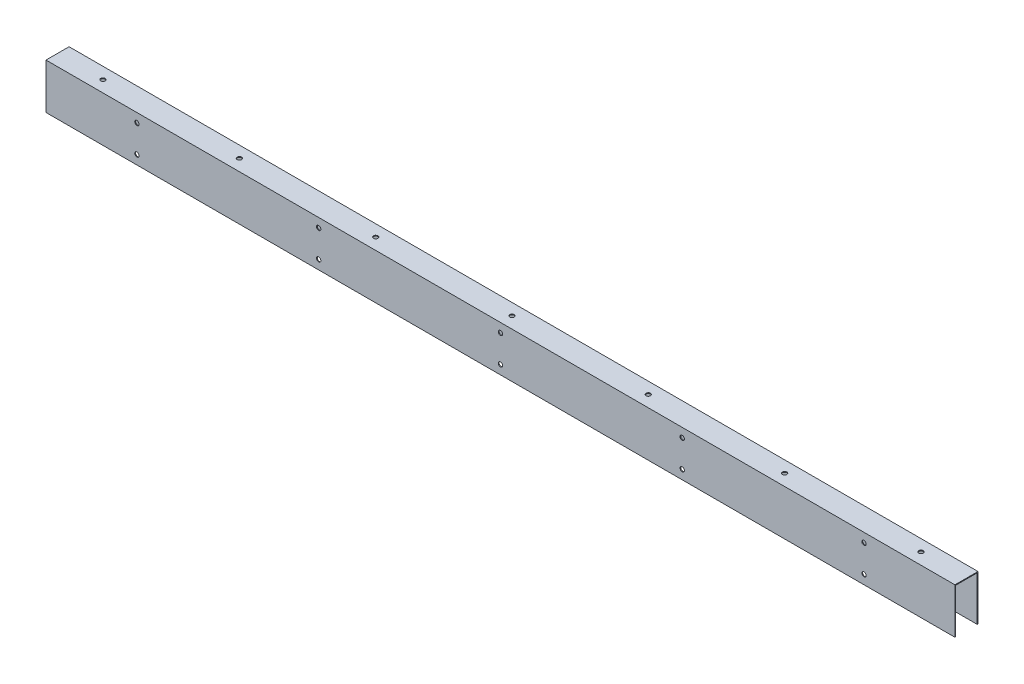
ISO-10303-21;
HEADER;
FILE_DESCRIPTION(('STEP AP214'),'2;1');
FILE_NAME('part.step','',(''),(''),'','','');
FILE_SCHEMA(('AUTOMOTIVE_DESIGN { 1 0 10303 214 1 1 1 1 }'));
ENDSEC;
DATA;
#1=APPLICATION_CONTEXT('core data for automotive mechanical design processes');
#2=APPLICATION_PROTOCOL_DEFINITION('international standard','automotive_design',2000,#1);
#3=PRODUCT_CONTEXT('',#1,'mechanical');
#4=PRODUCT('Part','Part','',(#3));
#5=PRODUCT_RELATED_PRODUCT_CATEGORY('part','',(#4));
#6=PRODUCT_DEFINITION_FORMATION('','',#4);
#7=PRODUCT_DEFINITION_CONTEXT('part definition',#1,'design');
#8=PRODUCT_DEFINITION('design','',#6,#7);
#9=PRODUCT_DEFINITION_SHAPE('','',#8);
#10=(LENGTH_UNIT() NAMED_UNIT(*) SI_UNIT(.MILLI.,.METRE.));
#11=(NAMED_UNIT(*) PLANE_ANGLE_UNIT() SI_UNIT($,.RADIAN.));
#12=(NAMED_UNIT(*) SI_UNIT($,.STERADIAN.) SOLID_ANGLE_UNIT());
#13=UNCERTAINTY_MEASURE_WITH_UNIT(LENGTH_MEASURE(1.E-05),#10,'distance_accuracy_value','');
#14=(GEOMETRIC_REPRESENTATION_CONTEXT(3) GLOBAL_UNCERTAINTY_ASSIGNED_CONTEXT((#13)) GLOBAL_UNIT_ASSIGNED_CONTEXT((#10,
#11,#12)) REPRESENTATION_CONTEXT('',''));
#15=CARTESIAN_POINT('',(0.,0.,0.));
#16=DIRECTION('',(0.,0.,1.));
#17=DIRECTION('',(1.,0.,0.));
#18=AXIS2_PLACEMENT_3D('',#15,#16,#17);
#19=CARTESIAN_POINT('',(499.999999999999,-25.,-12.7));
#20=DIRECTION('',(1.,0.,0.));
#21=DIRECTION('',(0.,0.,-1.));
#22=AXIS2_PLACEMENT_3D('',#19,#20,#21);
#23=PLANE('',#22);
#24=DIRECTION('',(0.,0.,-1.));
#25=VECTOR('',#24,1.);
#26=CARTESIAN_POINT('',(499.999999999999,-25.,-12.7));
#27=LINE('',#26,#25);
#28=CARTESIAN_POINT('',(499.999999999999,-25.,12.7));
#29=VERTEX_POINT('',#28);
#30=CARTESIAN_POINT('',(499.999999999999,-25.,11.84));
#31=VERTEX_POINT('',#30);
#32=EDGE_CURVE('E134',#29,#31,#27,.T.);
#33=ORIENTED_EDGE('',*,*,#32,.T.);
#34=DIRECTION('',(0.,1.,0.));
#35=VECTOR('',#34,1.);
#36=CARTESIAN_POINT('',(499.999999999999,-25.,11.84));
#37=LINE('',#36,#35);
#38=CARTESIAN_POINT('',(499.999999999999,24.14,11.84));
#39=VERTEX_POINT('',#38);
#40=EDGE_CURVE('E116',#31,#39,#37,.T.);
#41=ORIENTED_EDGE('',*,*,#40,.T.);
#42=DIRECTION('',(0.,0.,-1.));
#43=VECTOR('',#42,1.);
#44=CARTESIAN_POINT('',(499.999999999999,24.14,-12.7));
#45=LINE('',#44,#43);
#46=CARTESIAN_POINT('',(499.999999999999,24.14,-11.84));
#47=VERTEX_POINT('',#46);
#48=EDGE_CURVE('E111',#39,#47,#45,.T.);
#49=ORIENTED_EDGE('',*,*,#48,.T.);
#50=DIRECTION('',(0.,-1.,0.));
#51=VECTOR('',#50,1.);
#52=CARTESIAN_POINT('',(499.999999999999,-25.,-11.84));
#53=LINE('',#52,#51);
#54=CARTESIAN_POINT('',(499.999999999999,-25.,-11.84));
#55=VERTEX_POINT('',#54);
#56=EDGE_CURVE('E99',#47,#55,#53,.T.);
#57=ORIENTED_EDGE('',*,*,#56,.T.);
#58=CARTESIAN_POINT('',(499.999999999999,-25.,-12.7));
#59=VERTEX_POINT('',#58);
#60=EDGE_CURVE('E133',#55,#59,#27,.T.);
#61=ORIENTED_EDGE('',*,*,#60,.T.);
#62=DIRECTION('',(0.,1.,0.));
#63=VECTOR('',#62,1.);
#64=CARTESIAN_POINT('',(499.999999999999,-25.,-12.7));
#65=LINE('',#64,#63);
#66=CARTESIAN_POINT('',(499.999999999999,25.,-12.7));
#67=VERTEX_POINT('',#66);
#68=EDGE_CURVE('E146',#59,#67,#65,.T.);
#69=ORIENTED_EDGE('',*,*,#68,.T.);
#70=DIRECTION('',(0.,0.,-1.));
#71=VECTOR('',#70,1.);
#72=CARTESIAN_POINT('',(499.999999999999,25.,-12.7));
#73=LINE('',#72,#71);
#74=CARTESIAN_POINT('',(499.999999999999,25.,12.7));
#75=VERTEX_POINT('',#74);
#76=EDGE_CURVE('E117',#75,#67,#73,.T.);
#77=ORIENTED_EDGE('',*,*,#76,.F.);
#78=DIRECTION('',(0.,1.,0.));
#79=VECTOR('',#78,1.);
#80=CARTESIAN_POINT('',(499.999999999999,-25.,12.7));
#81=LINE('',#80,#79);
#82=EDGE_CURVE('E57',#29,#75,#81,.T.);
#83=ORIENTED_EDGE('',*,*,#82,.F.);
#84=EDGE_LOOP('',(#33,#41,#49,#57,#61,#69,#77,#83));
#85=FACE_BOUND('',#84,.T.);
#86=ADVANCED_FACE('F33',(#85),#23,.T.);
#87=CARTESIAN_POINT('',(-500.000000000001,-25.,-12.7));
#88=DIRECTION('',(-1.,0.,0.));
#89=DIRECTION('',(0.,0.,1.));
#90=AXIS2_PLACEMENT_3D('',#87,#88,#89);
#91=PLANE('',#90);
#92=DIRECTION('',(0.,0.,1.));
#93=VECTOR('',#92,1.);
#94=CARTESIAN_POINT('',(-500.000000000001,24.14,-12.7));
#95=LINE('',#94,#93);
#96=CARTESIAN_POINT('',(-500.000000000001,24.14,-11.84));
#97=VERTEX_POINT('',#96);
#98=CARTESIAN_POINT('',(-500.000000000001,24.14,11.84));
#99=VERTEX_POINT('',#98);
#100=EDGE_CURVE('E11',#97,#99,#95,.T.);
#101=ORIENTED_EDGE('',*,*,#100,.T.);
#102=DIRECTION('',(0.,-1.,0.));
#103=VECTOR('',#102,1.);
#104=CARTESIAN_POINT('',(-500.000000000001,-25.,11.84));
#105=LINE('',#104,#103);
#106=CARTESIAN_POINT('',(-500.000000000001,-25.,11.84));
#107=VERTEX_POINT('',#106);
#108=EDGE_CURVE('E106',#99,#107,#105,.T.);
#109=ORIENTED_EDGE('',*,*,#108,.T.);
#110=DIRECTION('',(0.,0.,1.));
#111=VECTOR('',#110,1.);
#112=CARTESIAN_POINT('',(-500.000000000001,-25.,-12.7));
#113=LINE('',#112,#111);
#114=CARTESIAN_POINT('',(-500.000000000001,-25.,12.7));
#115=VERTEX_POINT('',#114);
#116=EDGE_CURVE('E139',#107,#115,#113,.T.);
#117=ORIENTED_EDGE('',*,*,#116,.T.);
#118=DIRECTION('',(0.,1.,0.));
#119=VECTOR('',#118,1.);
#120=CARTESIAN_POINT('',(-500.000000000001,-25.,12.7));
#121=LINE('',#120,#119);
#122=CARTESIAN_POINT('',(-500.000000000001,25.,12.7));
#123=VERTEX_POINT('',#122);
#124=EDGE_CURVE('E148',#115,#123,#121,.T.);
#125=ORIENTED_EDGE('',*,*,#124,.T.);
#126=DIRECTION('',(0.,0.,1.));
#127=VECTOR('',#126,1.);
#128=CARTESIAN_POINT('',(-500.000000000001,25.,-12.7));
#129=LINE('',#128,#127);
#130=CARTESIAN_POINT('',(-500.000000000001,25.,-12.7));
#131=VERTEX_POINT('',#130);
#132=EDGE_CURVE('E127',#131,#123,#129,.T.);
#133=ORIENTED_EDGE('',*,*,#132,.F.);
#134=DIRECTION('',(0.,1.,0.));
#135=VECTOR('',#134,1.);
#136=CARTESIAN_POINT('',(-500.000000000001,-25.,-12.7));
#137=LINE('',#136,#135);
#138=CARTESIAN_POINT('',(-500.000000000001,-25.,-12.7));
#139=VERTEX_POINT('',#138);
#140=EDGE_CURVE('E150',#139,#131,#137,.T.);
#141=ORIENTED_EDGE('',*,*,#140,.F.);
#142=CARTESIAN_POINT('',(-500.000000000001,-25.,-11.84));
#143=VERTEX_POINT('',#142);
#144=EDGE_CURVE('E140',#139,#143,#113,.T.);
#145=ORIENTED_EDGE('',*,*,#144,.T.);
#146=DIRECTION('',(0.,1.,0.));
#147=VECTOR('',#146,1.);
#148=CARTESIAN_POINT('',(-500.000000000001,-25.,-11.84));
#149=LINE('',#148,#147);
#150=EDGE_CURVE('E49',#143,#97,#149,.T.);
#151=ORIENTED_EDGE('',*,*,#150,.T.);
#152=EDGE_LOOP('',(#101,#109,#117,#125,#133,#141,#145,#151));
#153=FACE_BOUND('',#152,.T.);
#154=ADVANCED_FACE('F271',(#153),#91,.T.);
#155=CARTESIAN_POINT('',(0.,-25.,0.));
#156=DIRECTION('',(0.,1.,0.));
#157=DIRECTION('',(0.,0.,1.));
#158=AXIS2_PLACEMENT_3D('',#155,#156,#157);
#159=PLANE('',#158);
#160=DIRECTION('',(-1.,0.,0.));
#161=VECTOR('',#160,1.);
#162=CARTESIAN_POINT('',(0.,-25.,11.84));
#163=LINE('',#162,#161);
#164=EDGE_CURVE('E41',#31,#107,#163,.T.);
#165=ORIENTED_EDGE('',*,*,#164,.F.);
#166=ORIENTED_EDGE('',*,*,#32,.F.);
#167=DIRECTION('',(1.,0.,0.));
#168=VECTOR('',#167,1.);
#169=CARTESIAN_POINT('',(-500.000000000001,-25.,12.7));
#170=LINE('',#169,#168);
#171=EDGE_CURVE('E143',#115,#29,#170,.T.);
#172=ORIENTED_EDGE('',*,*,#171,.F.);
#173=ORIENTED_EDGE('',*,*,#116,.F.);
#174=EDGE_LOOP('',(#165,#166,#172,#173));
#175=FACE_BOUND('',#174,.T.);
#176=ADVANCED_FACE('F277',(#175),#159,.F.);
#177=DIRECTION('',(1.,0.,0.));
#178=VECTOR('',#177,1.);
#179=CARTESIAN_POINT('',(0.,-25.,-11.84));
#180=LINE('',#179,#178);
#181=EDGE_CURVE('E103',#143,#55,#180,.T.);
#182=ORIENTED_EDGE('',*,*,#181,.F.);
#183=ORIENTED_EDGE('',*,*,#144,.F.);
#184=DIRECTION('',(-1.,0.,0.));
#185=VECTOR('',#184,1.);
#186=CARTESIAN_POINT('',(-500.000000000001,-25.,-12.7));
#187=LINE('',#186,#185);
#188=EDGE_CURVE('E136',#59,#139,#187,.T.);
#189=ORIENTED_EDGE('',*,*,#188,.F.);
#190=ORIENTED_EDGE('',*,*,#60,.F.);
#191=EDGE_LOOP('',(#182,#183,#189,#190));
#192=FACE_BOUND('',#191,.T.);
#193=ADVANCED_FACE('F291',(#192),#159,.F.);
#194=CARTESIAN_POINT('',(-500.000000000001,-25.,12.7));
#195=DIRECTION('',(0.,0.,1.));
#196=DIRECTION('',(1.,0.,0.));
#197=AXIS2_PLACEMENT_3D('',#194,#195,#196);
#198=PLANE('',#197);
#199=CARTESIAN_POINT('',(-200.,-15.0000000000014,12.7));
#200=DIRECTION('',(0.,0.,1.));
#201=DIRECTION('',(1.,0.,0.));
#202=AXIS2_PLACEMENT_3D('',#199,#200,#201);
#203=CIRCLE('',#202,2.4);
#204=CARTESIAN_POINT('',(-197.6,-15.0000000000014,12.7));
#205=VERTEX_POINT('',#204);
#206=EDGE_CURVE('E159',#205,#205,#203,.F.);
#207=ORIENTED_EDGE('',*,*,#206,.T.);
#208=EDGE_LOOP('',(#207));
#209=FACE_BOUND('',#208,.T.);
#210=CARTESIAN_POINT('',(0.,15.,12.7));
#211=DIRECTION('',(0.,0.,1.));
#212=DIRECTION('',(1.,0.,0.));
#213=AXIS2_PLACEMENT_3D('',#210,#211,#212);
#214=CIRCLE('',#213,2.4);
#215=CARTESIAN_POINT('',(2.4,15.,12.7));
#216=VERTEX_POINT('',#215);
#217=EDGE_CURVE('E242',#216,#216,#214,.F.);
#218=ORIENTED_EDGE('',*,*,#217,.T.);
#219=EDGE_LOOP('',(#218));
#220=FACE_BOUND('',#219,.T.);
#221=CARTESIAN_POINT('',(0.,-15.,12.7));
#222=DIRECTION('',(0.,0.,1.));
#223=DIRECTION('',(1.,0.,0.));
#224=AXIS2_PLACEMENT_3D('',#221,#222,#223);
#225=CIRCLE('',#224,2.4);
#226=CARTESIAN_POINT('',(2.4,-15.,12.7));
#227=VERTEX_POINT('',#226);
#228=EDGE_CURVE('E225',#227,#227,#225,.F.);
#229=ORIENTED_EDGE('',*,*,#228,.T.);
#230=EDGE_LOOP('',(#229));
#231=FACE_BOUND('',#230,.T.);
#232=CARTESIAN_POINT('',(200.,15.,12.7));
#233=DIRECTION('',(0.,0.,1.));
#234=DIRECTION('',(1.,0.,0.));
#235=AXIS2_PLACEMENT_3D('',#232,#233,#234);
#236=CIRCLE('',#235,2.4);
#237=CARTESIAN_POINT('',(202.4,15.,12.7));
#238=VERTEX_POINT('',#237);
#239=EDGE_CURVE('E221',#238,#238,#236,.F.);
#240=ORIENTED_EDGE('',*,*,#239,.T.);
#241=EDGE_LOOP('',(#240));
#242=FACE_BOUND('',#241,.T.);
#243=CARTESIAN_POINT('',(-400.,14.9999999999972,12.7));
#244=DIRECTION('',(0.,0.,1.));
#245=DIRECTION('',(1.,0.,0.));
#246=AXIS2_PLACEMENT_3D('',#243,#244,#245);
#247=CIRCLE('',#246,2.40000000000003);
#248=CARTESIAN_POINT('',(-397.6,14.9999999999972,12.7));
#249=VERTEX_POINT('',#248);
#250=EDGE_CURVE('E217',#249,#249,#247,.F.);
#251=ORIENTED_EDGE('',*,*,#250,.T.);
#252=EDGE_LOOP('',(#251));
#253=FACE_BOUND('',#252,.T.);
#254=CARTESIAN_POINT('',(-400.,-15.0000000000028,12.7));
#255=DIRECTION('',(0.,0.,1.));
#256=DIRECTION('',(1.,0.,0.));
#257=AXIS2_PLACEMENT_3D('',#254,#255,#256);
#258=CIRCLE('',#257,2.40000000000003);
#259=CARTESIAN_POINT('',(-397.6,-15.0000000000028,12.7));
#260=VERTEX_POINT('',#259);
#261=EDGE_CURVE('E212',#260,#260,#258,.F.);
#262=ORIENTED_EDGE('',*,*,#261,.T.);
#263=EDGE_LOOP('',(#262));
#264=FACE_BOUND('',#263,.T.);
#265=CARTESIAN_POINT('',(-200.,14.9999999999986,12.7));
#266=DIRECTION('',(0.,0.,1.));
#267=DIRECTION('',(1.,0.,0.));
#268=AXIS2_PLACEMENT_3D('',#265,#266,#267);
#269=CIRCLE('',#268,2.4);
#270=CARTESIAN_POINT('',(-197.6,14.9999999999986,12.7));
#271=VERTEX_POINT('',#270);
#272=EDGE_CURVE('E207',#271,#271,#269,.F.);
#273=ORIENTED_EDGE('',*,*,#272,.T.);
#274=EDGE_LOOP('',(#273));
#275=FACE_BOUND('',#274,.T.);
#276=CARTESIAN_POINT('',(200.,-15.,12.7));
#277=DIRECTION('',(0.,0.,1.));
#278=DIRECTION('',(1.,0.,0.));
#279=AXIS2_PLACEMENT_3D('',#276,#277,#278);
#280=CIRCLE('',#279,2.4);
#281=CARTESIAN_POINT('',(202.4,-15.,12.7));
#282=VERTEX_POINT('',#281);
#283=EDGE_CURVE('E202',#282,#282,#280,.F.);
#284=ORIENTED_EDGE('',*,*,#283,.T.);
#285=EDGE_LOOP('',(#284));
#286=FACE_BOUND('',#285,.T.);
#287=CARTESIAN_POINT('',(400.,15.,12.7));
#288=DIRECTION('',(0.,0.,1.));
#289=DIRECTION('',(1.,0.,0.));
#290=AXIS2_PLACEMENT_3D('',#287,#288,#289);
#291=CIRCLE('',#290,2.40000000000003);
#292=CARTESIAN_POINT('',(402.4,15.,12.7));
#293=VERTEX_POINT('',#292);
#294=EDGE_CURVE('E197',#293,#293,#291,.F.);
#295=ORIENTED_EDGE('',*,*,#294,.T.);
#296=EDGE_LOOP('',(#295));
#297=FACE_BOUND('',#296,.T.);
#298=CARTESIAN_POINT('',(400.,-15.,12.7));
#299=DIRECTION('',(0.,0.,1.));
#300=DIRECTION('',(1.,0.,0.));
#301=AXIS2_PLACEMENT_3D('',#298,#299,#300);
#302=CIRCLE('',#301,2.40000000000003);
#303=CARTESIAN_POINT('',(402.4,-15.,12.7));
#304=VERTEX_POINT('',#303);
#305=EDGE_CURVE('E192',#304,#304,#302,.F.);
#306=ORIENTED_EDGE('',*,*,#305,.T.);
#307=EDGE_LOOP('',(#306));
#308=FACE_BOUND('',#307,.T.);
#309=ORIENTED_EDGE('',*,*,#82,.T.);
#310=DIRECTION('',(1.,0.,0.));
#311=VECTOR('',#310,1.);
#312=CARTESIAN_POINT('',(-500.000000000001,25.,12.7));
#313=LINE('',#312,#311);
#314=EDGE_CURVE('E130',#123,#75,#313,.T.);
#315=ORIENTED_EDGE('',*,*,#314,.F.);
#316=ORIENTED_EDGE('',*,*,#124,.F.);
#317=ORIENTED_EDGE('',*,*,#171,.T.);
#318=EDGE_LOOP('',(#309,#315,#316,#317));
#319=FACE_BOUND('',#318,.T.);
#320=ADVANCED_FACE('F279',(#209,#220,#231,#242,#253,#264,#275,#286,#297,#308,#319),#198,.T.);
#321=CARTESIAN_POINT('',(-500.000000000001,-25.,-12.7));
#322=DIRECTION('',(0.,0.,-1.));
#323=DIRECTION('',(-1.,0.,0.));
#324=AXIS2_PLACEMENT_3D('',#321,#322,#323);
#325=PLANE('',#324);
#326=CARTESIAN_POINT('',(-200.,-15.0000000000014,-12.7));
#327=DIRECTION('',(0.,0.,-1.));
#328=DIRECTION('',(-1.,0.,0.));
#329=AXIS2_PLACEMENT_3D('',#326,#327,#328);
#330=CIRCLE('',#329,2.4);
#331=CARTESIAN_POINT('',(-202.4,-15.0000000000014,-12.7));
#332=VERTEX_POINT('',#331);
#333=EDGE_CURVE('E248',#332,#332,#330,.F.);
#334=ORIENTED_EDGE('',*,*,#333,.T.);
#335=EDGE_LOOP('',(#334));
#336=FACE_BOUND('',#335,.T.);
#337=CARTESIAN_POINT('',(0.,15.,-12.7));
#338=DIRECTION('',(0.,0.,-1.));
#339=DIRECTION('',(-1.,0.,0.));
#340=AXIS2_PLACEMENT_3D('',#337,#338,#339);
#341=CIRCLE('',#340,2.4);
#342=CARTESIAN_POINT('',(-2.4,15.,-12.7));
#343=VERTEX_POINT('',#342);
#344=EDGE_CURVE('E229',#343,#343,#341,.F.);
#345=ORIENTED_EDGE('',*,*,#344,.T.);
#346=EDGE_LOOP('',(#345));
#347=FACE_BOUND('',#346,.T.);
#348=CARTESIAN_POINT('',(0.,-15.,-12.7));
#349=DIRECTION('',(0.,0.,-1.));
#350=DIRECTION('',(-1.,0.,0.));
#351=AXIS2_PLACEMENT_3D('',#348,#349,#350);
#352=CIRCLE('',#351,2.4);
#353=CARTESIAN_POINT('',(-2.4,-15.,-12.7));
#354=VERTEX_POINT('',#353);
#355=EDGE_CURVE('E232',#354,#354,#352,.F.);
#356=ORIENTED_EDGE('',*,*,#355,.T.);
#357=EDGE_LOOP('',(#356));
#358=FACE_BOUND('',#357,.T.);
#359=CARTESIAN_POINT('',(200.,15.,-12.7));
#360=DIRECTION('',(0.,0.,-1.));
#361=DIRECTION('',(-1.,0.,0.));
#362=AXIS2_PLACEMENT_3D('',#359,#360,#361);
#363=CIRCLE('',#362,2.4);
#364=CARTESIAN_POINT('',(197.6,15.,-12.7));
#365=VERTEX_POINT('',#364);
#366=EDGE_CURVE('E324',#365,#365,#363,.F.);
#367=ORIENTED_EDGE('',*,*,#366,.T.);
#368=EDGE_LOOP('',(#367));
#369=FACE_BOUND('',#368,.T.);
#370=CARTESIAN_POINT('',(-400.,14.9999999999972,-12.7));
#371=DIRECTION('',(0.,0.,-1.));
#372=DIRECTION('',(-1.,0.,0.));
#373=AXIS2_PLACEMENT_3D('',#370,#371,#372);
#374=CIRCLE('',#373,2.40000000000003);
#375=CARTESIAN_POINT('',(-402.4,14.9999999999972,-12.7));
#376=VERTEX_POINT('',#375);
#377=EDGE_CURVE('E328',#376,#376,#374,.F.);
#378=ORIENTED_EDGE('',*,*,#377,.T.);
#379=EDGE_LOOP('',(#378));
#380=FACE_BOUND('',#379,.T.);
#381=CARTESIAN_POINT('',(-400.,-15.0000000000028,-12.7));
#382=DIRECTION('',(0.,0.,-1.));
#383=DIRECTION('',(-1.,0.,0.));
#384=AXIS2_PLACEMENT_3D('',#381,#382,#383);
#385=CIRCLE('',#384,2.40000000000003);
#386=CARTESIAN_POINT('',(-402.4,-15.0000000000028,-12.7));
#387=VERTEX_POINT('',#386);
#388=EDGE_CURVE('E332',#387,#387,#385,.F.);
#389=ORIENTED_EDGE('',*,*,#388,.T.);
#390=EDGE_LOOP('',(#389));
#391=FACE_BOUND('',#390,.T.);
#392=CARTESIAN_POINT('',(-200.,14.9999999999986,-12.7));
#393=DIRECTION('',(0.,0.,-1.));
#394=DIRECTION('',(-1.,0.,0.));
#395=AXIS2_PLACEMENT_3D('',#392,#393,#394);
#396=CIRCLE('',#395,2.4);
#397=CARTESIAN_POINT('',(-202.4,14.9999999999986,-12.7));
#398=VERTEX_POINT('',#397);
#399=EDGE_CURVE('E336',#398,#398,#396,.F.);
#400=ORIENTED_EDGE('',*,*,#399,.T.);
#401=EDGE_LOOP('',(#400));
#402=FACE_BOUND('',#401,.T.);
#403=CARTESIAN_POINT('',(200.,-15.,-12.7));
#404=DIRECTION('',(0.,0.,-1.));
#405=DIRECTION('',(-1.,0.,0.));
#406=AXIS2_PLACEMENT_3D('',#403,#404,#405);
#407=CIRCLE('',#406,2.4);
#408=CARTESIAN_POINT('',(197.6,-15.,-12.7));
#409=VERTEX_POINT('',#408);
#410=EDGE_CURVE('E340',#409,#409,#407,.F.);
#411=ORIENTED_EDGE('',*,*,#410,.T.);
#412=EDGE_LOOP('',(#411));
#413=FACE_BOUND('',#412,.T.);
#414=CARTESIAN_POINT('',(400.,15.,-12.7));
#415=DIRECTION('',(0.,0.,-1.));
#416=DIRECTION('',(-1.,0.,0.));
#417=AXIS2_PLACEMENT_3D('',#414,#415,#416);
#418=CIRCLE('',#417,2.40000000000003);
#419=CARTESIAN_POINT('',(397.6,15.,-12.7));
#420=VERTEX_POINT('',#419);
#421=EDGE_CURVE('E344',#420,#420,#418,.F.);
#422=ORIENTED_EDGE('',*,*,#421,.T.);
#423=EDGE_LOOP('',(#422));
#424=FACE_BOUND('',#423,.T.);
#425=CARTESIAN_POINT('',(400.,-15.,-12.7));
#426=DIRECTION('',(0.,0.,-1.));
#427=DIRECTION('',(-1.,0.,0.));
#428=AXIS2_PLACEMENT_3D('',#425,#426,#427);
#429=CIRCLE('',#428,2.40000000000003);
#430=CARTESIAN_POINT('',(397.6,-15.,-12.7));
#431=VERTEX_POINT('',#430);
#432=EDGE_CURVE('E347',#431,#431,#429,.F.);
#433=ORIENTED_EDGE('',*,*,#432,.T.);
#434=EDGE_LOOP('',(#433));
#435=FACE_BOUND('',#434,.T.);
#436=ORIENTED_EDGE('',*,*,#140,.T.);
#437=DIRECTION('',(-1.,0.,0.));
#438=VECTOR('',#437,1.);
#439=CARTESIAN_POINT('',(-500.000000000001,25.,-12.7));
#440=LINE('',#439,#438);
#441=EDGE_CURVE('E120',#67,#131,#440,.T.);
#442=ORIENTED_EDGE('',*,*,#441,.F.);
#443=ORIENTED_EDGE('',*,*,#68,.F.);
#444=ORIENTED_EDGE('',*,*,#188,.T.);
#445=EDGE_LOOP('',(#436,#442,#443,#444));
#446=FACE_BOUND('',#445,.T.);
#447=ADVANCED_FACE('F287',(#336,#347,#358,#369,#380,#391,#402,#413,#424,#435,#446),#325,.T.);
#448=CARTESIAN_POINT('',(0.,25.,0.));
#449=DIRECTION('',(0.,1.,0.));
#450=DIRECTION('',(0.,0.,1.));
#451=AXIS2_PLACEMENT_3D('',#448,#449,#450);
#452=PLANE('',#451);
#453=CARTESIAN_POINT('',(-450.,25.,3.14233320495882E-12));
#454=DIRECTION('',(0.,1.,0.));
#455=DIRECTION('',(0.,0.,1.));
#456=AXIS2_PLACEMENT_3D('',#453,#454,#455);
#457=CIRCLE('',#456,2.45);
#458=CARTESIAN_POINT('',(-450.,25.,2.45000000000314));
#459=VERTEX_POINT('',#458);
#460=EDGE_CURVE('E183',#459,#459,#457,.F.);
#461=ORIENTED_EDGE('',*,*,#460,.T.);
#462=EDGE_LOOP('',(#461));
#463=FACE_BOUND('',#462,.T.);
#464=CARTESIAN_POINT('',(-300.,25.,2.09488880330588E-12));
#465=DIRECTION('',(0.,1.,0.));
#466=DIRECTION('',(0.,0.,1.));
#467=AXIS2_PLACEMENT_3D('',#464,#465,#466);
#468=CIRCLE('',#467,2.45);
#469=CARTESIAN_POINT('',(-300.,25.,2.45000000000209));
#470=VERTEX_POINT('',#469);
#471=EDGE_CURVE('E179',#470,#470,#468,.F.);
#472=ORIENTED_EDGE('',*,*,#471,.T.);
#473=EDGE_LOOP('',(#472));
#474=FACE_BOUND('',#473,.T.);
#475=CARTESIAN_POINT('',(150.,25.,0.));
#476=DIRECTION('',(0.,1.,0.));
#477=DIRECTION('',(0.,0.,1.));
#478=AXIS2_PLACEMENT_3D('',#475,#476,#477);
#479=CIRCLE('',#478,2.45);
#480=CARTESIAN_POINT('',(150.,25.,2.45));
#481=VERTEX_POINT('',#480);
#482=EDGE_CURVE('E175',#481,#481,#479,.F.);
#483=ORIENTED_EDGE('',*,*,#482,.T.);
#484=EDGE_LOOP('',(#483));
#485=FACE_BOUND('',#484,.T.);
#486=CARTESIAN_POINT('',(300.,25.,0.));
#487=DIRECTION('',(0.,1.,0.));
#488=DIRECTION('',(0.,0.,1.));
#489=AXIS2_PLACEMENT_3D('',#486,#487,#488);
#490=CIRCLE('',#489,2.45);
#491=CARTESIAN_POINT('',(300.,25.,2.45));
#492=VERTEX_POINT('',#491);
#493=EDGE_CURVE('E171',#492,#492,#490,.F.);
#494=ORIENTED_EDGE('',*,*,#493,.T.);
#495=EDGE_LOOP('',(#494));
#496=FACE_BOUND('',#495,.T.);
#497=CARTESIAN_POINT('',(450.,25.,0.));
#498=DIRECTION('',(0.,1.,0.));
#499=DIRECTION('',(0.,0.,1.));
#500=AXIS2_PLACEMENT_3D('',#497,#498,#499);
#501=CIRCLE('',#500,2.45);
#502=CARTESIAN_POINT('',(450.,25.,2.45));
#503=VERTEX_POINT('',#502);
#504=EDGE_CURVE('E167',#503,#503,#501,.F.);
#505=ORIENTED_EDGE('',*,*,#504,.T.);
#506=EDGE_LOOP('',(#505));
#507=FACE_BOUND('',#506,.T.);
#508=CARTESIAN_POINT('',(-150.,25.,1.04744440165294E-12));
#509=DIRECTION('',(0.,1.,0.));
#510=DIRECTION('',(0.,0.,1.));
#511=AXIS2_PLACEMENT_3D('',#508,#509,#510);
#512=CIRCLE('',#511,2.45);
#513=CARTESIAN_POINT('',(-150.,25.,2.45000000000105));
#514=VERTEX_POINT('',#513);
#515=EDGE_CURVE('E163',#514,#514,#512,.F.);
#516=ORIENTED_EDGE('',*,*,#515,.T.);
#517=EDGE_LOOP('',(#516));
#518=FACE_BOUND('',#517,.T.);
#519=CARTESIAN_POINT('',(0.,25.,0.));
#520=DIRECTION('',(0.,1.,0.));
#521=DIRECTION('',(0.,0.,1.));
#522=AXIS2_PLACEMENT_3D('',#519,#520,#521);
#523=CIRCLE('',#522,2.45);
#524=CARTESIAN_POINT('',(0.,25.,2.45));
#525=VERTEX_POINT('',#524);
#526=EDGE_CURVE('E158',#525,#525,#523,.F.);
#527=ORIENTED_EDGE('',*,*,#526,.T.);
#528=EDGE_LOOP('',(#527));
#529=FACE_BOUND('',#528,.T.);
#530=ORIENTED_EDGE('',*,*,#76,.T.);
#531=ORIENTED_EDGE('',*,*,#441,.T.);
#532=ORIENTED_EDGE('',*,*,#132,.T.);
#533=ORIENTED_EDGE('',*,*,#314,.T.);
#534=EDGE_LOOP('',(#530,#531,#532,#533));
#535=FACE_BOUND('',#534,.T.);
#536=ADVANCED_FACE('F283',(#463,#474,#485,#496,#507,#518,#529,#535),#452,.T.);
#537=CARTESIAN_POINT('',(762.,24.14,11.84));
#538=DIRECTION('',(0.,0.,-1.));
#539=DIRECTION('',(0.,1.,0.));
#540=AXIS2_PLACEMENT_3D('',#537,#538,#539);
#541=PLANE('',#540);
#542=CARTESIAN_POINT('',(-200.,-15.0000000000014,11.84));
#543=DIRECTION('',(0.,0.,-1.));
#544=DIRECTION('',(0.,1.,0.));
#545=AXIS2_PLACEMENT_3D('',#542,#543,#544);
#546=CIRCLE('',#545,2.4);
#547=CARTESIAN_POINT('',(-200.,-12.6000000000014,11.84));
#548=VERTEX_POINT('',#547);
#549=EDGE_CURVE('E245',#548,#548,#546,.F.);
#550=ORIENTED_EDGE('',*,*,#549,.T.);
#551=EDGE_LOOP('',(#550));
#552=FACE_BOUND('',#551,.T.);
#553=CARTESIAN_POINT('',(0.,15.,11.84));
#554=DIRECTION('',(0.,0.,-1.));
#555=DIRECTION('',(0.,1.,0.));
#556=AXIS2_PLACEMENT_3D('',#553,#554,#555);
#557=CIRCLE('',#556,2.4);
#558=CARTESIAN_POINT('',(0.,17.4,11.84));
#559=VERTEX_POINT('',#558);
#560=EDGE_CURVE('E224',#559,#559,#557,.F.);
#561=ORIENTED_EDGE('',*,*,#560,.T.);
#562=EDGE_LOOP('',(#561));
#563=FACE_BOUND('',#562,.T.);
#564=CARTESIAN_POINT('',(0.,-15.,11.84));
#565=DIRECTION('',(0.,0.,-1.));
#566=DIRECTION('',(0.,1.,0.));
#567=AXIS2_PLACEMENT_3D('',#564,#565,#566);
#568=CIRCLE('',#567,2.4);
#569=CARTESIAN_POINT('',(0.,-12.6,11.84));
#570=VERTEX_POINT('',#569);
#571=EDGE_CURVE('E220',#570,#570,#568,.F.);
#572=ORIENTED_EDGE('',*,*,#571,.T.);
#573=EDGE_LOOP('',(#572));
#574=FACE_BOUND('',#573,.T.);
#575=CARTESIAN_POINT('',(200.,15.,11.84));
#576=DIRECTION('',(0.,0.,-1.));
#577=DIRECTION('',(0.,1.,0.));
#578=AXIS2_PLACEMENT_3D('',#575,#576,#577);
#579=CIRCLE('',#578,2.4);
#580=CARTESIAN_POINT('',(200.,17.4,11.84));
#581=VERTEX_POINT('',#580);
#582=EDGE_CURVE('E216',#581,#581,#579,.F.);
#583=ORIENTED_EDGE('',*,*,#582,.T.);
#584=EDGE_LOOP('',(#583));
#585=FACE_BOUND('',#584,.T.);
#586=CARTESIAN_POINT('',(-400.,14.9999999999972,11.84));
#587=DIRECTION('',(0.,0.,-1.));
#588=DIRECTION('',(0.,1.,0.));
#589=AXIS2_PLACEMENT_3D('',#586,#587,#588);
#590=CIRCLE('',#589,2.40000000000003);
#591=CARTESIAN_POINT('',(-400.,17.3999999999972,11.84));
#592=VERTEX_POINT('',#591);
#593=EDGE_CURVE('E211',#592,#592,#590,.F.);
#594=ORIENTED_EDGE('',*,*,#593,.T.);
#595=EDGE_LOOP('',(#594));
#596=FACE_BOUND('',#595,.T.);
#597=CARTESIAN_POINT('',(-400.,-15.0000000000028,11.84));
#598=DIRECTION('',(0.,0.,-1.));
#599=DIRECTION('',(0.,1.,0.));
#600=AXIS2_PLACEMENT_3D('',#597,#598,#599);
#601=CIRCLE('',#600,2.40000000000003);
#602=CARTESIAN_POINT('',(-400.,-12.6000000000028,11.84));
#603=VERTEX_POINT('',#602);
#604=EDGE_CURVE('E206',#603,#603,#601,.F.);
#605=ORIENTED_EDGE('',*,*,#604,.T.);
#606=EDGE_LOOP('',(#605));
#607=FACE_BOUND('',#606,.T.);
#608=CARTESIAN_POINT('',(-200.,14.9999999999986,11.84));
#609=DIRECTION('',(0.,0.,-1.));
#610=DIRECTION('',(0.,1.,0.));
#611=AXIS2_PLACEMENT_3D('',#608,#609,#610);
#612=CIRCLE('',#611,2.4);
#613=CARTESIAN_POINT('',(-200.,17.3999999999986,11.84));
#614=VERTEX_POINT('',#613);
#615=EDGE_CURVE('E201',#614,#614,#612,.F.);
#616=ORIENTED_EDGE('',*,*,#615,.T.);
#617=EDGE_LOOP('',(#616));
#618=FACE_BOUND('',#617,.T.);
#619=CARTESIAN_POINT('',(200.,-15.,11.84));
#620=DIRECTION('',(0.,0.,-1.));
#621=DIRECTION('',(0.,1.,0.));
#622=AXIS2_PLACEMENT_3D('',#619,#620,#621);
#623=CIRCLE('',#622,2.4);
#624=CARTESIAN_POINT('',(200.,-12.6,11.84));
#625=VERTEX_POINT('',#624);
#626=EDGE_CURVE('E196',#625,#625,#623,.F.);
#627=ORIENTED_EDGE('',*,*,#626,.T.);
#628=EDGE_LOOP('',(#627));
#629=FACE_BOUND('',#628,.T.);
#630=CARTESIAN_POINT('',(400.,15.,11.84));
#631=DIRECTION('',(0.,0.,-1.));
#632=DIRECTION('',(0.,1.,0.));
#633=AXIS2_PLACEMENT_3D('',#630,#631,#632);
#634=CIRCLE('',#633,2.40000000000003);
#635=CARTESIAN_POINT('',(400.,17.4,11.84));
#636=VERTEX_POINT('',#635);
#637=EDGE_CURVE('E191',#636,#636,#634,.F.);
#638=ORIENTED_EDGE('',*,*,#637,.T.);
#639=EDGE_LOOP('',(#638));
#640=FACE_BOUND('',#639,.T.);
#641=CARTESIAN_POINT('',(400.,-15.,11.84));
#642=DIRECTION('',(0.,0.,-1.));
#643=DIRECTION('',(0.,1.,0.));
#644=AXIS2_PLACEMENT_3D('',#641,#642,#643);
#645=CIRCLE('',#644,2.40000000000003);
#646=CARTESIAN_POINT('',(400.,-12.6,11.84));
#647=VERTEX_POINT('',#646);
#648=EDGE_CURVE('E187',#647,#647,#645,.F.);
#649=ORIENTED_EDGE('',*,*,#648,.T.);
#650=EDGE_LOOP('',(#649));
#651=FACE_BOUND('',#650,.T.);
#652=ORIENTED_EDGE('',*,*,#164,.T.);
#653=ORIENTED_EDGE('',*,*,#108,.F.);
#654=DIRECTION('',(-1.,0.,0.));
#655=VECTOR('',#654,1.);
#656=CARTESIAN_POINT('',(762.,24.14,11.84));
#657=LINE('',#656,#655);
#658=EDGE_CURVE('E113',#39,#99,#657,.T.);
#659=ORIENTED_EDGE('',*,*,#658,.F.);
#660=ORIENTED_EDGE('',*,*,#40,.F.);
#661=EDGE_LOOP('',(#652,#653,#659,#660));
#662=FACE_BOUND('',#661,.T.);
#663=ADVANCED_FACE('F313',(#552,#563,#574,#585,#596,#607,#618,#629,#640,#651,#662),#541,.T.);
#664=CARTESIAN_POINT('',(762.,24.14,-11.84));
#665=DIRECTION('',(0.,0.,1.));
#666=DIRECTION('',(0.,-1.,0.));
#667=AXIS2_PLACEMENT_3D('',#664,#665,#666);
#668=PLANE('',#667);
#669=CARTESIAN_POINT('',(-200.,-15.0000000000014,-11.84));
#670=DIRECTION('',(0.,0.,1.));
#671=DIRECTION('',(0.,-1.,0.));
#672=AXIS2_PLACEMENT_3D('',#669,#670,#671);
#673=CIRCLE('',#672,2.4);
#674=CARTESIAN_POINT('',(-200.,-17.4000000000014,-11.84));
#675=VERTEX_POINT('',#674);
#676=EDGE_CURVE('E36',#675,#675,#673,.F.);
#677=ORIENTED_EDGE('',*,*,#676,.T.);
#678=EDGE_LOOP('',(#677));
#679=FACE_BOUND('',#678,.T.);
#680=CARTESIAN_POINT('',(0.,15.,-11.84));
#681=DIRECTION('',(0.,0.,1.));
#682=DIRECTION('',(0.,-1.,0.));
#683=AXIS2_PLACEMENT_3D('',#680,#681,#682);
#684=CIRCLE('',#683,2.4);
#685=CARTESIAN_POINT('',(0.,12.6,-11.84));
#686=VERTEX_POINT('',#685);
#687=EDGE_CURVE('E222',#686,#686,#684,.F.);
#688=ORIENTED_EDGE('',*,*,#687,.T.);
#689=EDGE_LOOP('',(#688));
#690=FACE_BOUND('',#689,.T.);
#691=CARTESIAN_POINT('',(0.,-15.,-11.84));
#692=DIRECTION('',(0.,0.,1.));
#693=DIRECTION('',(0.,-1.,0.));
#694=AXIS2_PLACEMENT_3D('',#691,#692,#693);
#695=CIRCLE('',#694,2.4);
#696=CARTESIAN_POINT('',(0.,-17.4,-11.84));
#697=VERTEX_POINT('',#696);
#698=EDGE_CURVE('E218',#697,#697,#695,.F.);
#699=ORIENTED_EDGE('',*,*,#698,.T.);
#700=EDGE_LOOP('',(#699));
#701=FACE_BOUND('',#700,.T.);
#702=CARTESIAN_POINT('',(200.,15.,-11.84));
#703=DIRECTION('',(0.,0.,1.));
#704=DIRECTION('',(0.,-1.,0.));
#705=AXIS2_PLACEMENT_3D('',#702,#703,#704);
#706=CIRCLE('',#705,2.4);
#707=CARTESIAN_POINT('',(200.,12.6,-11.84));
#708=VERTEX_POINT('',#707);
#709=EDGE_CURVE('E213',#708,#708,#706,.F.);
#710=ORIENTED_EDGE('',*,*,#709,.T.);
#711=EDGE_LOOP('',(#710));
#712=FACE_BOUND('',#711,.T.);
#713=CARTESIAN_POINT('',(-400.,14.9999999999972,-11.84));
#714=DIRECTION('',(0.,0.,1.));
#715=DIRECTION('',(0.,-1.,0.));
#716=AXIS2_PLACEMENT_3D('',#713,#714,#715);
#717=CIRCLE('',#716,2.40000000000003);
#718=CARTESIAN_POINT('',(-400.,12.5999999999972,-11.84));
#719=VERTEX_POINT('',#718);
#720=EDGE_CURVE('E208',#719,#719,#717,.F.);
#721=ORIENTED_EDGE('',*,*,#720,.T.);
#722=EDGE_LOOP('',(#721));
#723=FACE_BOUND('',#722,.T.);
#724=CARTESIAN_POINT('',(-400.,-15.0000000000028,-11.84));
#725=DIRECTION('',(0.,0.,1.));
#726=DIRECTION('',(0.,-1.,0.));
#727=AXIS2_PLACEMENT_3D('',#724,#725,#726);
#728=CIRCLE('',#727,2.40000000000003);
#729=CARTESIAN_POINT('',(-400.,-17.4000000000028,-11.84));
#730=VERTEX_POINT('',#729);
#731=EDGE_CURVE('E203',#730,#730,#728,.F.);
#732=ORIENTED_EDGE('',*,*,#731,.T.);
#733=EDGE_LOOP('',(#732));
#734=FACE_BOUND('',#733,.T.);
#735=CARTESIAN_POINT('',(-200.,14.9999999999986,-11.84));
#736=DIRECTION('',(0.,0.,1.));
#737=DIRECTION('',(0.,-1.,0.));
#738=AXIS2_PLACEMENT_3D('',#735,#736,#737);
#739=CIRCLE('',#738,2.4);
#740=CARTESIAN_POINT('',(-200.,12.5999999999986,-11.84));
#741=VERTEX_POINT('',#740);
#742=EDGE_CURVE('E198',#741,#741,#739,.F.);
#743=ORIENTED_EDGE('',*,*,#742,.T.);
#744=EDGE_LOOP('',(#743));
#745=FACE_BOUND('',#744,.T.);
#746=CARTESIAN_POINT('',(200.,-15.,-11.84));
#747=DIRECTION('',(0.,0.,1.));
#748=DIRECTION('',(0.,-1.,0.));
#749=AXIS2_PLACEMENT_3D('',#746,#747,#748);
#750=CIRCLE('',#749,2.4);
#751=CARTESIAN_POINT('',(200.,-17.4,-11.84));
#752=VERTEX_POINT('',#751);
#753=EDGE_CURVE('E193',#752,#752,#750,.F.);
#754=ORIENTED_EDGE('',*,*,#753,.T.);
#755=EDGE_LOOP('',(#754));
#756=FACE_BOUND('',#755,.T.);
#757=CARTESIAN_POINT('',(400.,15.,-11.84));
#758=DIRECTION('',(0.,0.,1.));
#759=DIRECTION('',(0.,-1.,0.));
#760=AXIS2_PLACEMENT_3D('',#757,#758,#759);
#761=CIRCLE('',#760,2.40000000000003);
#762=CARTESIAN_POINT('',(400.,12.6,-11.84));
#763=VERTEX_POINT('',#762);
#764=EDGE_CURVE('E188',#763,#763,#761,.F.);
#765=ORIENTED_EDGE('',*,*,#764,.T.);
#766=EDGE_LOOP('',(#765));
#767=FACE_BOUND('',#766,.T.);
#768=CARTESIAN_POINT('',(400.,-15.,-11.84));
#769=DIRECTION('',(0.,0.,1.));
#770=DIRECTION('',(0.,-1.,0.));
#771=AXIS2_PLACEMENT_3D('',#768,#769,#770);
#772=CIRCLE('',#771,2.40000000000003);
#773=CARTESIAN_POINT('',(400.,-17.4,-11.84));
#774=VERTEX_POINT('',#773);
#775=EDGE_CURVE('E184',#774,#774,#772,.F.);
#776=ORIENTED_EDGE('',*,*,#775,.T.);
#777=EDGE_LOOP('',(#776));
#778=FACE_BOUND('',#777,.T.);
#779=DIRECTION('',(-1.,0.,0.));
#780=VECTOR('',#779,1.);
#781=CARTESIAN_POINT('',(762.,24.14,-11.84));
#782=LINE('',#781,#780);
#783=EDGE_CURVE('E102',#47,#97,#782,.T.);
#784=ORIENTED_EDGE('',*,*,#783,.T.);
#785=ORIENTED_EDGE('',*,*,#150,.F.);
#786=ORIENTED_EDGE('',*,*,#181,.T.);
#787=ORIENTED_EDGE('',*,*,#56,.F.);
#788=EDGE_LOOP('',(#784,#785,#786,#787));
#789=FACE_BOUND('',#788,.T.);
#790=ADVANCED_FACE('F101',(#679,#690,#701,#712,#723,#734,#745,#756,#767,#778,#789),#668,.T.);
#791=CARTESIAN_POINT('',(762.,24.14,11.84));
#792=DIRECTION('',(0.,-1.,0.));
#793=DIRECTION('',(0.,0.,-1.));
#794=AXIS2_PLACEMENT_3D('',#791,#792,#793);
#795=PLANE('',#794);
#796=CARTESIAN_POINT('',(-450.,24.14,3.14233320495882E-12));
#797=DIRECTION('',(0.,-1.,0.));
#798=DIRECTION('',(0.,0.,-1.));
#799=AXIS2_PLACEMENT_3D('',#796,#797,#798);
#800=CIRCLE('',#799,2.45);
#801=CARTESIAN_POINT('',(-450.,24.14,-2.44999999999686));
#802=VERTEX_POINT('',#801);
#803=EDGE_CURVE('E180',#802,#802,#800,.F.);
#804=ORIENTED_EDGE('',*,*,#803,.T.);
#805=EDGE_LOOP('',(#804));
#806=FACE_BOUND('',#805,.T.);
#807=CARTESIAN_POINT('',(-300.,24.14,2.09488880330588E-12));
#808=DIRECTION('',(0.,-1.,0.));
#809=DIRECTION('',(0.,0.,-1.));
#810=AXIS2_PLACEMENT_3D('',#807,#808,#809);
#811=CIRCLE('',#810,2.45);
#812=CARTESIAN_POINT('',(-300.,24.14,-2.4499999999979));
#813=VERTEX_POINT('',#812);
#814=EDGE_CURVE('E176',#813,#813,#811,.F.);
#815=ORIENTED_EDGE('',*,*,#814,.T.);
#816=EDGE_LOOP('',(#815));
#817=FACE_BOUND('',#816,.T.);
#818=CARTESIAN_POINT('',(150.,24.14,0.));
#819=DIRECTION('',(0.,-1.,0.));
#820=DIRECTION('',(0.,0.,-1.));
#821=AXIS2_PLACEMENT_3D('',#818,#819,#820);
#822=CIRCLE('',#821,2.45);
#823=CARTESIAN_POINT('',(150.,24.14,-2.45));
#824=VERTEX_POINT('',#823);
#825=EDGE_CURVE('E172',#824,#824,#822,.F.);
#826=ORIENTED_EDGE('',*,*,#825,.T.);
#827=EDGE_LOOP('',(#826));
#828=FACE_BOUND('',#827,.T.);
#829=CARTESIAN_POINT('',(300.,24.14,0.));
#830=DIRECTION('',(0.,-1.,0.));
#831=DIRECTION('',(0.,0.,-1.));
#832=AXIS2_PLACEMENT_3D('',#829,#830,#831);
#833=CIRCLE('',#832,2.45);
#834=CARTESIAN_POINT('',(300.,24.14,-2.45));
#835=VERTEX_POINT('',#834);
#836=EDGE_CURVE('E168',#835,#835,#833,.F.);
#837=ORIENTED_EDGE('',*,*,#836,.T.);
#838=EDGE_LOOP('',(#837));
#839=FACE_BOUND('',#838,.T.);
#840=CARTESIAN_POINT('',(450.,24.14,0.));
#841=DIRECTION('',(0.,-1.,0.));
#842=DIRECTION('',(0.,0.,-1.));
#843=AXIS2_PLACEMENT_3D('',#840,#841,#842);
#844=CIRCLE('',#843,2.45);
#845=CARTESIAN_POINT('',(450.,24.14,-2.45));
#846=VERTEX_POINT('',#845);
#847=EDGE_CURVE('E164',#846,#846,#844,.F.);
#848=ORIENTED_EDGE('',*,*,#847,.T.);
#849=EDGE_LOOP('',(#848));
#850=FACE_BOUND('',#849,.T.);
#851=CARTESIAN_POINT('',(-150.,24.14,1.04744440165294E-12));
#852=DIRECTION('',(0.,-1.,0.));
#853=DIRECTION('',(0.,0.,-1.));
#854=AXIS2_PLACEMENT_3D('',#851,#852,#853);
#855=CIRCLE('',#854,2.45);
#856=CARTESIAN_POINT('',(-150.,24.14,-2.44999999999895));
#857=VERTEX_POINT('',#856);
#858=EDGE_CURVE('E160',#857,#857,#855,.F.);
#859=ORIENTED_EDGE('',*,*,#858,.T.);
#860=EDGE_LOOP('',(#859));
#861=FACE_BOUND('',#860,.T.);
#862=CARTESIAN_POINT('',(0.,24.14,0.));
#863=DIRECTION('',(0.,-1.,0.));
#864=DIRECTION('',(0.,0.,-1.));
#865=AXIS2_PLACEMENT_3D('',#862,#863,#864);
#866=CIRCLE('',#865,2.45);
#867=CARTESIAN_POINT('',(0.,24.14,-2.45));
#868=VERTEX_POINT('',#867);
#869=EDGE_CURVE('E155',#868,#868,#866,.F.);
#870=ORIENTED_EDGE('',*,*,#869,.T.);
#871=EDGE_LOOP('',(#870));
#872=FACE_BOUND('',#871,.T.);
#873=ORIENTED_EDGE('',*,*,#658,.T.);
#874=ORIENTED_EDGE('',*,*,#100,.F.);
#875=ORIENTED_EDGE('',*,*,#783,.F.);
#876=ORIENTED_EDGE('',*,*,#48,.F.);
#877=EDGE_LOOP('',(#873,#874,#875,#876));
#878=FACE_BOUND('',#877,.T.);
#879=ADVANCED_FACE('F110',(#806,#817,#828,#839,#850,#861,#872,#878),#795,.T.);
#880=CARTESIAN_POINT('',(0.,39.05,0.));
#881=DIRECTION('',(0.,-1.,0.));
#882=DIRECTION('',(0.,0.,-1.));
#883=AXIS2_PLACEMENT_3D('',#880,#881,#882);
#884=CYLINDRICAL_SURFACE('',#883,2.45);
#885=ORIENTED_EDGE('',*,*,#526,.F.);
#886=EDGE_LOOP('',(#885));
#887=FACE_BOUND('',#886,.T.);
#888=ORIENTED_EDGE('',*,*,#869,.F.);
#889=EDGE_LOOP('',(#888));
#890=FACE_BOUND('',#889,.T.);
#891=ADVANCED_FACE('F480',(#887,#890),#884,.F.);
#892=CARTESIAN_POINT('',(-150.,39.05,1.04744440165294E-12));
#893=DIRECTION('',(0.,-1.,0.));
#894=DIRECTION('',(0.,0.,-1.));
#895=AXIS2_PLACEMENT_3D('',#892,#893,#894);
#896=CYLINDRICAL_SURFACE('',#895,2.45);
#897=ORIENTED_EDGE('',*,*,#515,.F.);
#898=EDGE_LOOP('',(#897));
#899=FACE_BOUND('',#898,.T.);
#900=ORIENTED_EDGE('',*,*,#858,.F.);
#901=EDGE_LOOP('',(#900));
#902=FACE_BOUND('',#901,.T.);
#903=ADVANCED_FACE('F483',(#899,#902),#896,.F.);
#904=CARTESIAN_POINT('',(450.,39.05,0.));
#905=DIRECTION('',(0.,-1.,0.));
#906=DIRECTION('',(0.,0.,-1.));
#907=AXIS2_PLACEMENT_3D('',#904,#905,#906);
#908=CYLINDRICAL_SURFACE('',#907,2.45);
#909=ORIENTED_EDGE('',*,*,#504,.F.);
#910=EDGE_LOOP('',(#909));
#911=FACE_BOUND('',#910,.T.);
#912=ORIENTED_EDGE('',*,*,#847,.F.);
#913=EDGE_LOOP('',(#912));
#914=FACE_BOUND('',#913,.T.);
#915=ADVANCED_FACE('F493',(#911,#914),#908,.F.);
#916=CARTESIAN_POINT('',(300.,39.05,0.));
#917=DIRECTION('',(0.,-1.,0.));
#918=DIRECTION('',(0.,0.,-1.));
#919=AXIS2_PLACEMENT_3D('',#916,#917,#918);
#920=CYLINDRICAL_SURFACE('',#919,2.45);
#921=ORIENTED_EDGE('',*,*,#493,.F.);
#922=EDGE_LOOP('',(#921));
#923=FACE_BOUND('',#922,.T.);
#924=ORIENTED_EDGE('',*,*,#836,.F.);
#925=EDGE_LOOP('',(#924));
#926=FACE_BOUND('',#925,.T.);
#927=ADVANCED_FACE('F490',(#923,#926),#920,.F.);
#928=CARTESIAN_POINT('',(150.,39.05,0.));
#929=DIRECTION('',(0.,-1.,0.));
#930=DIRECTION('',(0.,0.,-1.));
#931=AXIS2_PLACEMENT_3D('',#928,#929,#930);
#932=CYLINDRICAL_SURFACE('',#931,2.45);
#933=ORIENTED_EDGE('',*,*,#482,.F.);
#934=EDGE_LOOP('',(#933));
#935=FACE_BOUND('',#934,.T.);
#936=ORIENTED_EDGE('',*,*,#825,.F.);
#937=EDGE_LOOP('',(#936));
#938=FACE_BOUND('',#937,.T.);
#939=ADVANCED_FACE('F488',(#935,#938),#932,.F.);
#940=CARTESIAN_POINT('',(-300.,39.05,2.09488880330588E-12));
#941=DIRECTION('',(0.,-1.,0.));
#942=DIRECTION('',(0.,0.,-1.));
#943=AXIS2_PLACEMENT_3D('',#940,#941,#942);
#944=CYLINDRICAL_SURFACE('',#943,2.45);
#945=ORIENTED_EDGE('',*,*,#471,.F.);
#946=EDGE_LOOP('',(#945));
#947=FACE_BOUND('',#946,.T.);
#948=ORIENTED_EDGE('',*,*,#814,.F.);
#949=EDGE_LOOP('',(#948));
#950=FACE_BOUND('',#949,.T.);
#951=ADVANCED_FACE('F453',(#947,#950),#944,.F.);
#952=CARTESIAN_POINT('',(-450.,39.05,3.14233320495882E-12));
#953=DIRECTION('',(0.,-1.,0.));
#954=DIRECTION('',(0.,0.,-1.));
#955=AXIS2_PLACEMENT_3D('',#952,#953,#954);
#956=CYLINDRICAL_SURFACE('',#955,2.45);
#957=ORIENTED_EDGE('',*,*,#460,.F.);
#958=EDGE_LOOP('',(#957));
#959=FACE_BOUND('',#958,.T.);
#960=ORIENTED_EDGE('',*,*,#803,.F.);
#961=EDGE_LOOP('',(#960));
#962=FACE_BOUND('',#961,.T.);
#963=ADVANCED_FACE('F443',(#959,#962),#956,.F.);
#964=CARTESIAN_POINT('',(400.,-15.,39.05));
#965=DIRECTION('',(0.,0.,-1.));
#966=DIRECTION('',(-1.,0.,0.));
#967=AXIS2_PLACEMENT_3D('',#964,#965,#966);
#968=CYLINDRICAL_SURFACE('',#967,2.40000000000003);
#969=ORIENTED_EDGE('',*,*,#432,.F.);
#970=EDGE_LOOP('',(#969));
#971=FACE_BOUND('',#970,.T.);
#972=ORIENTED_EDGE('',*,*,#775,.F.);
#973=EDGE_LOOP('',(#972));
#974=FACE_BOUND('',#973,.T.);
#975=ADVANCED_FACE('F440',(#971,#974),#968,.F.);
#976=CARTESIAN_POINT('',(400.,15.,39.05));
#977=DIRECTION('',(0.,0.,-1.));
#978=DIRECTION('',(-1.,0.,0.));
#979=AXIS2_PLACEMENT_3D('',#976,#977,#978);
#980=CYLINDRICAL_SURFACE('',#979,2.40000000000003);
#981=ORIENTED_EDGE('',*,*,#421,.F.);
#982=EDGE_LOOP('',(#981));
#983=FACE_BOUND('',#982,.T.);
#984=ORIENTED_EDGE('',*,*,#764,.F.);
#985=EDGE_LOOP('',(#984));
#986=FACE_BOUND('',#985,.T.);
#987=ADVANCED_FACE('F442',(#983,#986),#980,.F.);
#988=CARTESIAN_POINT('',(200.,-15.,39.05));
#989=DIRECTION('',(0.,0.,-1.));
#990=DIRECTION('',(-1.,0.,0.));
#991=AXIS2_PLACEMENT_3D('',#988,#989,#990);
#992=CYLINDRICAL_SURFACE('',#991,2.4);
#993=ORIENTED_EDGE('',*,*,#410,.F.);
#994=EDGE_LOOP('',(#993));
#995=FACE_BOUND('',#994,.T.);
#996=ORIENTED_EDGE('',*,*,#753,.F.);
#997=EDGE_LOOP('',(#996));
#998=FACE_BOUND('',#997,.T.);
#999=ADVANCED_FACE('F450',(#995,#998),#992,.F.);
#1000=CARTESIAN_POINT('',(-200.,14.9999999999986,39.05));
#1001=DIRECTION('',(0.,0.,-1.));
#1002=DIRECTION('',(-1.,0.,0.));
#1003=AXIS2_PLACEMENT_3D('',#1000,#1001,#1002);
#1004=CYLINDRICAL_SURFACE('',#1003,2.4);
#1005=ORIENTED_EDGE('',*,*,#399,.F.);
#1006=EDGE_LOOP('',(#1005));
#1007=FACE_BOUND('',#1006,.T.);
#1008=ORIENTED_EDGE('',*,*,#742,.F.);
#1009=EDGE_LOOP('',(#1008));
#1010=FACE_BOUND('',#1009,.T.);
#1011=ADVANCED_FACE('F508',(#1007,#1010),#1004,.F.);
#1012=CARTESIAN_POINT('',(-400.,-15.0000000000028,39.05));
#1013=DIRECTION('',(0.,0.,-1.));
#1014=DIRECTION('',(-1.,0.,0.));
#1015=AXIS2_PLACEMENT_3D('',#1012,#1013,#1014);
#1016=CYLINDRICAL_SURFACE('',#1015,2.40000000000003);
#1017=ORIENTED_EDGE('',*,*,#388,.F.);
#1018=EDGE_LOOP('',(#1017));
#1019=FACE_BOUND('',#1018,.T.);
#1020=ORIENTED_EDGE('',*,*,#731,.F.);
#1021=EDGE_LOOP('',(#1020));
#1022=FACE_BOUND('',#1021,.T.);
#1023=ADVANCED_FACE('F506',(#1019,#1022),#1016,.F.);
#1024=CARTESIAN_POINT('',(-400.,14.9999999999972,39.05));
#1025=DIRECTION('',(0.,0.,-1.));
#1026=DIRECTION('',(-1.,0.,0.));
#1027=AXIS2_PLACEMENT_3D('',#1024,#1025,#1026);
#1028=CYLINDRICAL_SURFACE('',#1027,2.40000000000003);
#1029=ORIENTED_EDGE('',*,*,#377,.F.);
#1030=EDGE_LOOP('',(#1029));
#1031=FACE_BOUND('',#1030,.T.);
#1032=ORIENTED_EDGE('',*,*,#720,.F.);
#1033=EDGE_LOOP('',(#1032));
#1034=FACE_BOUND('',#1033,.T.);
#1035=ADVANCED_FACE('F417',(#1031,#1034),#1028,.F.);
#1036=CARTESIAN_POINT('',(200.,15.,39.05));
#1037=DIRECTION('',(0.,0.,-1.));
#1038=DIRECTION('',(-1.,0.,0.));
#1039=AXIS2_PLACEMENT_3D('',#1036,#1037,#1038);
#1040=CYLINDRICAL_SURFACE('',#1039,2.4);
#1041=ORIENTED_EDGE('',*,*,#366,.F.);
#1042=EDGE_LOOP('',(#1041));
#1043=FACE_BOUND('',#1042,.T.);
#1044=ORIENTED_EDGE('',*,*,#709,.F.);
#1045=EDGE_LOOP('',(#1044));
#1046=FACE_BOUND('',#1045,.T.);
#1047=ADVANCED_FACE('F407',(#1043,#1046),#1040,.F.);
#1048=CARTESIAN_POINT('',(0.,-15.,39.05));
#1049=DIRECTION('',(0.,0.,-1.));
#1050=DIRECTION('',(-1.,0.,0.));
#1051=AXIS2_PLACEMENT_3D('',#1048,#1049,#1050);
#1052=CYLINDRICAL_SURFACE('',#1051,2.4);
#1053=ORIENTED_EDGE('',*,*,#355,.F.);
#1054=EDGE_LOOP('',(#1053));
#1055=FACE_BOUND('',#1054,.T.);
#1056=ORIENTED_EDGE('',*,*,#698,.F.);
#1057=EDGE_LOOP('',(#1056));
#1058=FACE_BOUND('',#1057,.T.);
#1059=ADVANCED_FACE('F395',(#1055,#1058),#1052,.F.);
#1060=CARTESIAN_POINT('',(0.,15.,39.05));
#1061=DIRECTION('',(0.,0.,-1.));
#1062=DIRECTION('',(-1.,0.,0.));
#1063=AXIS2_PLACEMENT_3D('',#1060,#1061,#1062);
#1064=CYLINDRICAL_SURFACE('',#1063,2.4);
#1065=ORIENTED_EDGE('',*,*,#344,.F.);
#1066=EDGE_LOOP('',(#1065));
#1067=FACE_BOUND('',#1066,.T.);
#1068=ORIENTED_EDGE('',*,*,#687,.F.);
#1069=EDGE_LOOP('',(#1068));
#1070=FACE_BOUND('',#1069,.T.);
#1071=ADVANCED_FACE('F403',(#1067,#1070),#1064,.F.);
#1072=CARTESIAN_POINT('',(-200.,-15.0000000000014,39.05));
#1073=DIRECTION('',(0.,0.,-1.));
#1074=DIRECTION('',(-1.,0.,0.));
#1075=AXIS2_PLACEMENT_3D('',#1072,#1073,#1074);
#1076=CYLINDRICAL_SURFACE('',#1075,2.4);
#1077=ORIENTED_EDGE('',*,*,#333,.F.);
#1078=EDGE_LOOP('',(#1077));
#1079=FACE_BOUND('',#1078,.T.);
#1080=ORIENTED_EDGE('',*,*,#676,.F.);
#1081=EDGE_LOOP('',(#1080));
#1082=FACE_BOUND('',#1081,.T.);
#1083=ADVANCED_FACE('F415',(#1079,#1082),#1076,.F.);
#1084=ORIENTED_EDGE('',*,*,#305,.F.);
#1085=EDGE_LOOP('',(#1084));
#1086=FACE_BOUND('',#1085,.T.);
#1087=ORIENTED_EDGE('',*,*,#648,.F.);
#1088=EDGE_LOOP('',(#1087));
#1089=FACE_BOUND('',#1088,.T.);
#1090=ADVANCED_FACE('F445',(#1086,#1089),#968,.F.);
#1091=ORIENTED_EDGE('',*,*,#294,.F.);
#1092=EDGE_LOOP('',(#1091));
#1093=FACE_BOUND('',#1092,.T.);
#1094=ORIENTED_EDGE('',*,*,#637,.F.);
#1095=EDGE_LOOP('',(#1094));
#1096=FACE_BOUND('',#1095,.T.);
#1097=ADVANCED_FACE('F452',(#1093,#1096),#980,.F.);
#1098=ORIENTED_EDGE('',*,*,#283,.F.);
#1099=EDGE_LOOP('',(#1098));
#1100=FACE_BOUND('',#1099,.T.);
#1101=ORIENTED_EDGE('',*,*,#626,.F.);
#1102=EDGE_LOOP('',(#1101));
#1103=FACE_BOUND('',#1102,.T.);
#1104=ADVANCED_FACE('F463',(#1100,#1103),#992,.F.);
#1105=ORIENTED_EDGE('',*,*,#272,.F.);
#1106=EDGE_LOOP('',(#1105));
#1107=FACE_BOUND('',#1106,.T.);
#1108=ORIENTED_EDGE('',*,*,#615,.F.);
#1109=EDGE_LOOP('',(#1108));
#1110=FACE_BOUND('',#1109,.T.);
#1111=ADVANCED_FACE('F512',(#1107,#1110),#1004,.F.);
#1112=ORIENTED_EDGE('',*,*,#261,.F.);
#1113=EDGE_LOOP('',(#1112));
#1114=FACE_BOUND('',#1113,.T.);
#1115=ORIENTED_EDGE('',*,*,#604,.F.);
#1116=EDGE_LOOP('',(#1115));
#1117=FACE_BOUND('',#1116,.T.);
#1118=ADVANCED_FACE('F515',(#1114,#1117),#1016,.F.);
#1119=ORIENTED_EDGE('',*,*,#250,.F.);
#1120=EDGE_LOOP('',(#1119));
#1121=FACE_BOUND('',#1120,.T.);
#1122=ORIENTED_EDGE('',*,*,#593,.F.);
#1123=EDGE_LOOP('',(#1122));
#1124=FACE_BOUND('',#1123,.T.);
#1125=ADVANCED_FACE('F404',(#1121,#1124),#1028,.F.);
#1126=ORIENTED_EDGE('',*,*,#239,.F.);
#1127=EDGE_LOOP('',(#1126));
#1128=FACE_BOUND('',#1127,.T.);
#1129=ORIENTED_EDGE('',*,*,#582,.F.);
#1130=EDGE_LOOP('',(#1129));
#1131=FACE_BOUND('',#1130,.T.);
#1132=ADVANCED_FACE('F392',(#1128,#1131),#1040,.F.);
#1133=ORIENTED_EDGE('',*,*,#228,.F.);
#1134=EDGE_LOOP('',(#1133));
#1135=FACE_BOUND('',#1134,.T.);
#1136=ORIENTED_EDGE('',*,*,#571,.F.);
#1137=EDGE_LOOP('',(#1136));
#1138=FACE_BOUND('',#1137,.T.);
#1139=ADVANCED_FACE('F389',(#1135,#1138),#1052,.F.);
#1140=ORIENTED_EDGE('',*,*,#217,.F.);
#1141=EDGE_LOOP('',(#1140));
#1142=FACE_BOUND('',#1141,.T.);
#1143=ORIENTED_EDGE('',*,*,#560,.F.);
#1144=EDGE_LOOP('',(#1143));
#1145=FACE_BOUND('',#1144,.T.);
#1146=ADVANCED_FACE('F391',(#1142,#1145),#1064,.F.);
#1147=ORIENTED_EDGE('',*,*,#206,.F.);
#1148=EDGE_LOOP('',(#1147));
#1149=FACE_BOUND('',#1148,.T.);
#1150=ORIENTED_EDGE('',*,*,#549,.F.);
#1151=EDGE_LOOP('',(#1150));
#1152=FACE_BOUND('',#1151,.T.);
#1153=ADVANCED_FACE('F400',(#1149,#1152),#1076,.F.);
#1154=CLOSED_SHELL('',(#86,#154,#176,#193,#320,#447,#536,#663,#790,#879,#891,#903,#915,#927,
#939,#951,#963,#975,#987,#999,#1011,#1023,#1035,#1047,#1059,#1071,#1083,#1090,#1097,#1104,#1111,
#1118,#1125,#1132,#1139,#1146,#1153));
#1155=MANIFOLD_SOLID_BREP('B2',#1154);
#1156=ADVANCED_BREP_SHAPE_REPRESENTATION('',(#18,#1155),#14);
#1157=SHAPE_DEFINITION_REPRESENTATION(#9,#1156);
ENDSEC;
END-ISO-10303-21;
